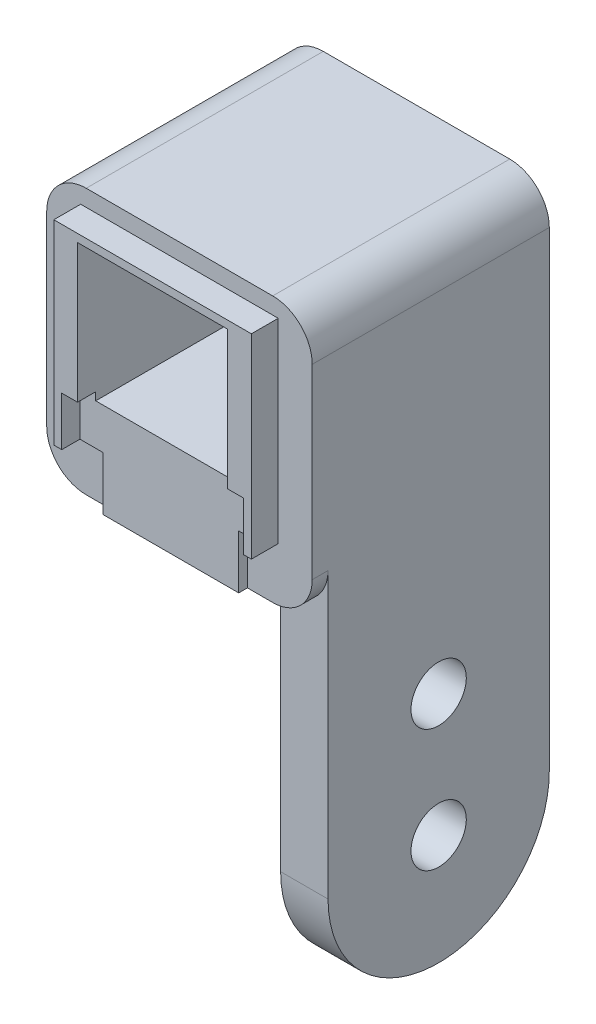
ISO-10303-21;
HEADER;
FILE_DESCRIPTION(('STEP AP214'),'2;1');
FILE_NAME('part.step','',(''),(''),'','','');
FILE_SCHEMA(('AUTOMOTIVE_DESIGN { 1 0 10303 214 1 1 1 1 }'));
ENDSEC;
DATA;
#1=APPLICATION_CONTEXT('core data for automotive mechanical design processes');
#2=APPLICATION_PROTOCOL_DEFINITION('international standard','automotive_design',2000,#1);
#3=PRODUCT_CONTEXT('',#1,'mechanical');
#4=PRODUCT('Part','Part','',(#3));
#5=PRODUCT_RELATED_PRODUCT_CATEGORY('part','',(#4));
#6=PRODUCT_DEFINITION_FORMATION('','',#4);
#7=PRODUCT_DEFINITION_CONTEXT('part definition',#1,'design');
#8=PRODUCT_DEFINITION('design','',#6,#7);
#9=PRODUCT_DEFINITION_SHAPE('','',#8);
#10=(LENGTH_UNIT() NAMED_UNIT(*) SI_UNIT(.MILLI.,.METRE.));
#11=(NAMED_UNIT(*) PLANE_ANGLE_UNIT() SI_UNIT($,.RADIAN.));
#12=(NAMED_UNIT(*) SI_UNIT($,.STERADIAN.) SOLID_ANGLE_UNIT());
#13=UNCERTAINTY_MEASURE_WITH_UNIT(LENGTH_MEASURE(1.E-05),#10,'distance_accuracy_value','');
#14=(GEOMETRIC_REPRESENTATION_CONTEXT(3) GLOBAL_UNCERTAINTY_ASSIGNED_CONTEXT((#13)) GLOBAL_UNIT_ASSIGNED_CONTEXT((#10,
#11,#12)) REPRESENTATION_CONTEXT('',''));
#15=CARTESIAN_POINT('',(0.,0.,0.));
#16=DIRECTION('',(0.,0.,1.));
#17=DIRECTION('',(1.,0.,0.));
#18=AXIS2_PLACEMENT_3D('',#15,#16,#17);
#19=CARTESIAN_POINT('',(0.,0.,1.1));
#20=DIRECTION('',(0.,0.,1.));
#21=DIRECTION('',(1.,0.,0.));
#22=AXIS2_PLACEMENT_3D('',#19,#20,#21);
#23=PLANE('',#22);
#24=DIRECTION('',(1.,0.,0.));
#25=VECTOR('',#24,1.);
#26=CARTESIAN_POINT('',(0.,-9.12041884816754,1.1));
#27=LINE('',#26,#25);
#28=CARTESIAN_POINT('',(9.09206947866898,-9.12041884816754,1.1));
#29=VERTEX_POINT('',#28);
#30=CARTESIAN_POINT('',(11.992069478669,-9.12041884816754,1.1));
#31=VERTEX_POINT('',#30);
#32=EDGE_CURVE('E52',#29,#31,#27,.T.);
#33=ORIENTED_EDGE('',*,*,#32,.T.);
#34=DIRECTION('',(0.,1.,0.));
#35=VECTOR('',#34,1.);
#36=CARTESIAN_POINT('',(11.992069478669,-9.12041884816754,1.1));
#37=LINE('',#36,#35);
#38=CARTESIAN_POINT('',(11.992069478669,-2.92041884816754,1.1));
#39=VERTEX_POINT('',#38);
#40=EDGE_CURVE('E259',#31,#39,#37,.T.);
#41=ORIENTED_EDGE('',*,*,#40,.T.);
#42=DIRECTION('',(-1.,0.,0.));
#43=VECTOR('',#42,1.);
#44=CARTESIAN_POINT('',(-12.007930521331,-2.92041884816754,1.1));
#45=LINE('',#44,#43);
#46=CARTESIAN_POINT('',(9.99206947866899,-2.92041884816754,1.1));
#47=VERTEX_POINT('',#46);
#48=EDGE_CURVE('E280',#39,#47,#45,.T.);
#49=ORIENTED_EDGE('',*,*,#48,.T.);
#50=DIRECTION('',(0.,1.,0.));
#51=VECTOR('',#50,1.);
#52=CARTESIAN_POINT('',(9.99206947866899,0.,1.1));
#53=LINE('',#52,#51);
#54=CARTESIAN_POINT('',(9.99206947866899,-3.92041884816754,1.1));
#55=VERTEX_POINT('',#54);
#56=EDGE_CURVE('E287',#55,#47,#53,.T.);
#57=ORIENTED_EDGE('',*,*,#56,.F.);
#58=DIRECTION('',(-1.,0.,0.));
#59=VECTOR('',#58,1.);
#60=CARTESIAN_POINT('',(0.,-3.92041884816754,1.1));
#61=LINE('',#60,#59);
#62=CARTESIAN_POINT('',(-9.00793052133102,-3.92041884816754,1.1));
#63=VERTEX_POINT('',#62);
#64=EDGE_CURVE('E314',#55,#63,#61,.T.);
#65=ORIENTED_EDGE('',*,*,#64,.T.);
#66=DIRECTION('',(0.,1.,0.));
#67=VECTOR('',#66,1.);
#68=CARTESIAN_POINT('',(-9.00793052133102,0.,1.1));
#69=LINE('',#68,#67);
#70=CARTESIAN_POINT('',(-9.00793052133102,-2.92041884816754,1.1));
#71=VERTEX_POINT('',#70);
#72=EDGE_CURVE('E282',#63,#71,#69,.T.);
#73=ORIENTED_EDGE('',*,*,#72,.T.);
#74=CARTESIAN_POINT('',(-11.007930521331,-2.92041884816754,1.1));
#75=VERTEX_POINT('',#74);
#76=EDGE_CURVE('E283',#71,#75,#45,.T.);
#77=ORIENTED_EDGE('',*,*,#76,.T.);
#78=DIRECTION('',(0.,1.,0.));
#79=VECTOR('',#78,1.);
#80=CARTESIAN_POINT('',(-11.007930521331,-9.12041884816754,1.1));
#81=LINE('',#80,#79);
#82=CARTESIAN_POINT('',(-11.007930521331,-9.12041884816754,1.1));
#83=VERTEX_POINT('',#82);
#84=EDGE_CURVE('E276',#83,#75,#81,.T.);
#85=ORIENTED_EDGE('',*,*,#84,.F.);
#86=CARTESIAN_POINT('',(-8.10793052133102,-9.12041884816754,1.1));
#87=VERTEX_POINT('',#86);
#88=EDGE_CURVE('E316',#83,#87,#27,.T.);
#89=ORIENTED_EDGE('',*,*,#88,.T.);
#90=DIRECTION('',(0.,-1.,0.));
#91=VECTOR('',#90,1.);
#92=CARTESIAN_POINT('',(-8.10793052133102,0.,1.1));
#93=LINE('',#92,#91);
#94=CARTESIAN_POINT('',(-8.10793052133102,-15.9204188481675,1.1));
#95=VERTEX_POINT('',#94);
#96=EDGE_CURVE('E297',#87,#95,#93,.T.);
#97=ORIENTED_EDGE('',*,*,#96,.T.);
#98=DIRECTION('',(1.,0.,0.));
#99=VECTOR('',#98,1.);
#100=CARTESIAN_POINT('',(0.,-15.9204188481675,1.1));
#101=LINE('',#100,#99);
#102=CARTESIAN_POINT('',(9.09206947866898,-15.9204188481675,1.1));
#103=VERTEX_POINT('',#102);
#104=EDGE_CURVE('E300',#95,#103,#101,.T.);
#105=ORIENTED_EDGE('',*,*,#104,.T.);
#106=DIRECTION('',(0.,-1.,0.));
#107=VECTOR('',#106,1.);
#108=CARTESIAN_POINT('',(9.09206947866898,0.,1.1));
#109=LINE('',#108,#107);
#110=EDGE_CURVE('E294',#29,#103,#109,.T.);
#111=ORIENTED_EDGE('',*,*,#110,.F.);
#112=EDGE_LOOP('',(#33,#41,#49,#57,#65,#73,#77,#85,#89,#97,#105,#111));
#113=FACE_BOUND('',#112,.T.);
#114=ADVANCED_FACE('F37',(#113),#23,.T.);
#115=CARTESIAN_POINT('',(-12.007930521331,-2.92041884816754,1.1));
#116=DIRECTION('',(0.,1.,0.));
#117=DIRECTION('',(-1.,0.,0.));
#118=AXIS2_PLACEMENT_3D('',#115,#116,#117);
#119=PLANE('',#118);
#120=DIRECTION('',(0.,0.,-1.));
#121=VECTOR('',#120,1.);
#122=CARTESIAN_POINT('',(11.992069478669,-2.92041884816754,3.4));
#123=LINE('',#122,#121);
#124=CARTESIAN_POINT('',(11.992069478669,-2.92041884816754,3.4));
#125=VERTEX_POINT('',#124);
#126=EDGE_CURVE('E60',#125,#39,#123,.T.);
#127=ORIENTED_EDGE('',*,*,#126,.F.);
#128=DIRECTION('',(-1.,0.,0.));
#129=VECTOR('',#128,1.);
#130=CARTESIAN_POINT('',(-12.007930521331,-2.92041884816754,3.4));
#131=LINE('',#130,#129);
#132=CARTESIAN_POINT('',(9.99206947866899,-2.92041884816754,3.4));
#133=VERTEX_POINT('',#132);
#134=EDGE_CURVE('E284',#125,#133,#131,.T.);
#135=ORIENTED_EDGE('',*,*,#134,.T.);
#136=DIRECTION('',(0.,0.,1.));
#137=VECTOR('',#136,1.);
#138=CARTESIAN_POINT('',(9.99206947866899,-2.92041884816754,3.4));
#139=LINE('',#138,#137);
#140=EDGE_CURVE('E290',#47,#133,#139,.T.);
#141=ORIENTED_EDGE('',*,*,#140,.F.);
#142=ORIENTED_EDGE('',*,*,#48,.F.);
#143=EDGE_LOOP('',(#127,#135,#141,#142));
#144=FACE_BOUND('',#143,.T.);
#145=ADVANCED_FACE('F548',(#144),#119,.F.);
#146=DIRECTION('',(0.,0.,1.));
#147=VECTOR('',#146,1.);
#148=CARTESIAN_POINT('',(-11.007930521331,-2.92041884816754,3.4));
#149=LINE('',#148,#147);
#150=CARTESIAN_POINT('',(-11.007930521331,-2.92041884816754,3.4));
#151=VERTEX_POINT('',#150);
#152=EDGE_CURVE('E265',#75,#151,#149,.T.);
#153=ORIENTED_EDGE('',*,*,#152,.F.);
#154=ORIENTED_EDGE('',*,*,#76,.F.);
#155=DIRECTION('',(0.,0.,1.));
#156=VECTOR('',#155,1.);
#157=CARTESIAN_POINT('',(-9.00793052133102,-2.92041884816754,3.4));
#158=LINE('',#157,#156);
#159=CARTESIAN_POINT('',(-9.00793052133102,-2.92041884816754,3.4));
#160=VERTEX_POINT('',#159);
#161=EDGE_CURVE('E11',#71,#160,#158,.T.);
#162=ORIENTED_EDGE('',*,*,#161,.T.);
#163=EDGE_CURVE('E279',#160,#151,#131,.T.);
#164=ORIENTED_EDGE('',*,*,#163,.T.);
#165=EDGE_LOOP('',(#153,#154,#162,#164));
#166=FACE_BOUND('',#165,.T.);
#167=ADVANCED_FACE('F563',(#166),#119,.F.);
#168=CARTESIAN_POINT('',(0.,-9.12041884816754,3.4));
#169=DIRECTION('',(0.,1.,0.));
#170=DIRECTION('',(0.,0.,1.));
#171=AXIS2_PLACEMENT_3D('',#168,#169,#170);
#172=PLANE('',#171);
#173=ORIENTED_EDGE('',*,*,#88,.F.);
#174=DIRECTION('',(0.,0.,1.));
#175=VECTOR('',#174,1.);
#176=CARTESIAN_POINT('',(-11.007930521331,-9.12041884816754,3.4));
#177=LINE('',#176,#175);
#178=CARTESIAN_POINT('',(-11.007930521331,-9.12041884816754,3.4));
#179=VERTEX_POINT('',#178);
#180=EDGE_CURVE('E266',#83,#179,#177,.T.);
#181=ORIENTED_EDGE('',*,*,#180,.T.);
#182=DIRECTION('',(-1.,0.,0.));
#183=VECTOR('',#182,1.);
#184=CARTESIAN_POINT('',(-12.007930521331,-9.12041884816754,3.4));
#185=LINE('',#184,#183);
#186=CARTESIAN_POINT('',(-12.007930521331,-9.12041884816754,3.4));
#187=VERTEX_POINT('',#186);
#188=EDGE_CURVE('E268',#179,#187,#185,.T.);
#189=ORIENTED_EDGE('',*,*,#188,.T.);
#190=DIRECTION('',(0.,0.,-1.));
#191=VECTOR('',#190,1.);
#192=CARTESIAN_POINT('',(-12.007930521331,-9.12041884816754,3.4));
#193=LINE('',#192,#191);
#194=CARTESIAN_POINT('',(-12.007930521331,-9.12041884816754,0.));
#195=VERTEX_POINT('',#194);
#196=EDGE_CURVE('E239',#187,#195,#193,.T.);
#197=ORIENTED_EDGE('',*,*,#196,.T.);
#198=DIRECTION('',(1.,0.,0.));
#199=VECTOR('',#198,1.);
#200=CARTESIAN_POINT('',(0.,-9.12041884816754,0.));
#201=LINE('',#200,#199);
#202=CARTESIAN_POINT('',(-8.10793052133102,-9.12041884816754,0.));
#203=VERTEX_POINT('',#202);
#204=EDGE_CURVE('E251',#195,#203,#201,.T.);
#205=ORIENTED_EDGE('',*,*,#204,.T.);
#206=DIRECTION('',(0.,0.,-1.));
#207=VECTOR('',#206,1.);
#208=CARTESIAN_POINT('',(-8.10793052133102,-9.12041884816754,1.1));
#209=LINE('',#208,#207);
#210=EDGE_CURVE('E310',#87,#203,#209,.T.);
#211=ORIENTED_EDGE('',*,*,#210,.F.);
#212=EDGE_LOOP('',(#173,#181,#189,#197,#205,#211));
#213=FACE_BOUND('',#212,.T.);
#214=ADVANCED_FACE('F514',(#213),#172,.F.);
#215=CARTESIAN_POINT('',(0.,-3.92041884816754,3.4));
#216=DIRECTION('',(0.,1.,0.));
#217=DIRECTION('',(0.,0.,1.));
#218=AXIS2_PLACEMENT_3D('',#215,#216,#217);
#219=PLANE('',#218);
#220=ORIENTED_EDGE('',*,*,#64,.F.);
#221=DIRECTION('',(0.,0.,-1.));
#222=VECTOR('',#221,1.);
#223=CARTESIAN_POINT('',(9.99206947866899,-3.92041884816754,3.4));
#224=LINE('',#223,#222);
#225=CARTESIAN_POINT('',(9.99206947866899,-3.92041884816754,-27.));
#226=VERTEX_POINT('',#225);
#227=EDGE_CURVE('E414',#55,#226,#224,.T.);
#228=ORIENTED_EDGE('',*,*,#227,.T.);
#229=DIRECTION('',(1.,0.,0.));
#230=VECTOR('',#229,1.);
#231=CARTESIAN_POINT('',(0.,-3.92041884816754,-27.));
#232=LINE('',#231,#230);
#233=CARTESIAN_POINT('',(-9.00793052133102,-3.92041884816754,-27.));
#234=VERTEX_POINT('',#233);
#235=EDGE_CURVE('E372',#234,#226,#232,.T.);
#236=ORIENTED_EDGE('',*,*,#235,.F.);
#237=DIRECTION('',(0.,0.,-1.));
#238=VECTOR('',#237,1.);
#239=CARTESIAN_POINT('',(-9.00793052133102,-3.92041884816754,3.4));
#240=LINE('',#239,#238);
#241=EDGE_CURVE('E412',#63,#234,#240,.T.);
#242=ORIENTED_EDGE('',*,*,#241,.F.);
#243=EDGE_LOOP('',(#220,#228,#236,#242));
#244=FACE_BOUND('',#243,.T.);
#245=ADVANCED_FACE('F608',(#244),#219,.T.);
#246=DIRECTION('',(0.,0.,-1.));
#247=VECTOR('',#246,1.);
#248=CARTESIAN_POINT('',(12.992069478669,-9.12041884816754,3.4));
#249=LINE('',#248,#247);
#250=CARTESIAN_POINT('',(12.992069478669,-9.12041884816754,3.4));
#251=VERTEX_POINT('',#250);
#252=CARTESIAN_POINT('',(12.992069478669,-9.12041884816754,0.));
#253=VERTEX_POINT('',#252);
#254=EDGE_CURVE('E227',#251,#253,#249,.T.);
#255=ORIENTED_EDGE('',*,*,#254,.F.);
#256=DIRECTION('',(-1.,0.,0.));
#257=VECTOR('',#256,1.);
#258=CARTESIAN_POINT('',(12.992069478669,-9.12041884816754,3.4));
#259=LINE('',#258,#257);
#260=CARTESIAN_POINT('',(11.992069478669,-9.12041884816754,3.4));
#261=VERTEX_POINT('',#260);
#262=EDGE_CURVE('E231',#251,#261,#259,.T.);
#263=ORIENTED_EDGE('',*,*,#262,.T.);
#264=DIRECTION('',(0.,0.,-1.));
#265=VECTOR('',#264,1.);
#266=CARTESIAN_POINT('',(11.992069478669,-9.12041884816754,3.4));
#267=LINE('',#266,#265);
#268=EDGE_CURVE('E257',#261,#31,#267,.T.);
#269=ORIENTED_EDGE('',*,*,#268,.T.);
#270=ORIENTED_EDGE('',*,*,#32,.F.);
#271=DIRECTION('',(0.,0.,-1.));
#272=VECTOR('',#271,1.);
#273=CARTESIAN_POINT('',(9.09206947866898,-9.12041884816754,1.1));
#274=LINE('',#273,#272);
#275=CARTESIAN_POINT('',(9.09206947866898,-9.12041884816754,0.));
#276=VERTEX_POINT('',#275);
#277=EDGE_CURVE('E312',#29,#276,#274,.T.);
#278=ORIENTED_EDGE('',*,*,#277,.T.);
#279=EDGE_CURVE('E235',#276,#253,#201,.T.);
#280=ORIENTED_EDGE('',*,*,#279,.T.);
#281=EDGE_LOOP('',(#255,#263,#269,#270,#278,#280));
#282=FACE_BOUND('',#281,.T.);
#283=ADVANCED_FACE('F229',(#282),#172,.F.);
#284=CARTESIAN_POINT('',(0.,0.,3.4));
#285=DIRECTION('',(0.,0.,1.));
#286=DIRECTION('',(1.,0.,0.));
#287=AXIS2_PLACEMENT_3D('',#284,#285,#286);
#288=PLANE('',#287);
#289=ORIENTED_EDGE('',*,*,#134,.F.);
#290=DIRECTION('',(0.,1.,0.));
#291=VECTOR('',#290,1.);
#292=CARTESIAN_POINT('',(11.992069478669,-9.12041884816754,3.4));
#293=LINE('',#292,#291);
#294=EDGE_CURVE('E255',#261,#125,#293,.T.);
#295=ORIENTED_EDGE('',*,*,#294,.F.);
#296=ORIENTED_EDGE('',*,*,#262,.F.);
#297=DIRECTION('',(0.,-1.,0.));
#298=VECTOR('',#297,1.);
#299=CARTESIAN_POINT('',(12.992069478669,0.,3.4));
#300=LINE('',#299,#298);
#301=CARTESIAN_POINT('',(12.992069478669,15.5795811518325,3.4));
#302=VERTEX_POINT('',#301);
#303=EDGE_CURVE('E243',#302,#251,#300,.T.);
#304=ORIENTED_EDGE('',*,*,#303,.F.);
#305=DIRECTION('',(1.,0.,0.));
#306=VECTOR('',#305,1.);
#307=CARTESIAN_POINT('',(0.,15.5795811518325,3.4));
#308=LINE('',#307,#306);
#309=CARTESIAN_POINT('',(-12.007930521331,15.5795811518325,3.4));
#310=VERTEX_POINT('',#309);
#311=EDGE_CURVE('E250',#310,#302,#308,.T.);
#312=ORIENTED_EDGE('',*,*,#311,.F.);
#313=DIRECTION('',(0.,-1.,0.));
#314=VECTOR('',#313,1.);
#315=CARTESIAN_POINT('',(-12.007930521331,0.,3.4));
#316=LINE('',#315,#314);
#317=EDGE_CURVE('E391',#310,#187,#316,.T.);
#318=ORIENTED_EDGE('',*,*,#317,.T.);
#319=ORIENTED_EDGE('',*,*,#188,.F.);
#320=DIRECTION('',(0.,1.,0.));
#321=VECTOR('',#320,1.);
#322=CARTESIAN_POINT('',(-11.007930521331,-9.12041884816754,3.4));
#323=LINE('',#322,#321);
#324=EDGE_CURVE('E271',#179,#151,#323,.T.);
#325=ORIENTED_EDGE('',*,*,#324,.T.);
#326=ORIENTED_EDGE('',*,*,#163,.F.);
#327=DIRECTION('',(0.,-1.,0.));
#328=VECTOR('',#327,1.);
#329=CARTESIAN_POINT('',(-9.00793052133102,0.,3.4));
#330=LINE('',#329,#328);
#331=CARTESIAN_POINT('',(-9.00793052133102,14.5795811518325,3.4));
#332=VERTEX_POINT('',#331);
#333=EDGE_CURVE('E240',#332,#160,#330,.T.);
#334=ORIENTED_EDGE('',*,*,#333,.F.);
#335=DIRECTION('',(1.,0.,0.));
#336=VECTOR('',#335,1.);
#337=CARTESIAN_POINT('',(0.,14.5795811518325,3.4));
#338=LINE('',#337,#336);
#339=CARTESIAN_POINT('',(9.99206947866899,14.5795811518325,3.4));
#340=VERTEX_POINT('',#339);
#341=EDGE_CURVE('E394',#332,#340,#338,.T.);
#342=ORIENTED_EDGE('',*,*,#341,.T.);
#343=DIRECTION('',(0.,-1.,0.));
#344=VECTOR('',#343,1.);
#345=CARTESIAN_POINT('',(9.99206947866899,0.,3.4));
#346=LINE('',#345,#344);
#347=EDGE_CURVE('E397',#340,#133,#346,.T.);
#348=ORIENTED_EDGE('',*,*,#347,.T.);
#349=EDGE_LOOP('',(#289,#295,#296,#304,#312,#318,#319,#325,#326,#334,#342,#348));
#350=FACE_BOUND('',#349,.T.);
#351=ADVANCED_FACE('F253',(#350),#288,.T.);
#352=CARTESIAN_POINT('',(0.,14.5795811518325,3.4));
#353=DIRECTION('',(0.,1.,0.));
#354=DIRECTION('',(0.,0.,1.));
#355=AXIS2_PLACEMENT_3D('',#352,#353,#354);
#356=PLANE('',#355);
#357=DIRECTION('',(0.,0.,-1.));
#358=VECTOR('',#357,1.);
#359=CARTESIAN_POINT('',(-9.00793052133102,14.5795811518325,3.4));
#360=LINE('',#359,#358);
#361=CARTESIAN_POINT('',(-9.00793052133102,14.5795811518325,-27.));
#362=VERTEX_POINT('',#361);
#363=EDGE_CURVE('E410',#332,#362,#360,.T.);
#364=ORIENTED_EDGE('',*,*,#363,.T.);
#365=DIRECTION('',(1.,0.,0.));
#366=VECTOR('',#365,1.);
#367=CARTESIAN_POINT('',(0.,14.5795811518325,-27.));
#368=LINE('',#367,#366);
#369=CARTESIAN_POINT('',(9.99206947866899,14.5795811518325,-27.));
#370=VERTEX_POINT('',#369);
#371=EDGE_CURVE('E365',#362,#370,#368,.T.);
#372=ORIENTED_EDGE('',*,*,#371,.T.);
#373=DIRECTION('',(0.,0.,-1.));
#374=VECTOR('',#373,1.);
#375=CARTESIAN_POINT('',(9.99206947866899,14.5795811518325,3.4));
#376=LINE('',#375,#374);
#377=EDGE_CURVE('E416',#340,#370,#376,.T.);
#378=ORIENTED_EDGE('',*,*,#377,.F.);
#379=ORIENTED_EDGE('',*,*,#341,.F.);
#380=EDGE_LOOP('',(#364,#372,#378,#379));
#381=FACE_BOUND('',#380,.T.);
#382=ADVANCED_FACE('F542',(#381),#356,.F.);
#383=CARTESIAN_POINT('',(9.99206947866899,0.,3.4));
#384=DIRECTION('',(1.,0.,0.));
#385=DIRECTION('',(0.,1.,0.));
#386=AXIS2_PLACEMENT_3D('',#383,#384,#385);
#387=PLANE('',#386);
#388=ORIENTED_EDGE('',*,*,#56,.T.);
#389=ORIENTED_EDGE('',*,*,#140,.T.);
#390=ORIENTED_EDGE('',*,*,#347,.F.);
#391=ORIENTED_EDGE('',*,*,#377,.T.);
#392=DIRECTION('',(0.,-1.,0.));
#393=VECTOR('',#392,1.);
#394=CARTESIAN_POINT('',(9.99206947866899,0.,-27.));
#395=LINE('',#394,#393);
#396=EDGE_CURVE('E368',#370,#226,#395,.T.);
#397=ORIENTED_EDGE('',*,*,#396,.T.);
#398=ORIENTED_EDGE('',*,*,#227,.F.);
#399=EDGE_LOOP('',(#388,#389,#390,#391,#397,#398));
#400=FACE_BOUND('',#399,.T.);
#401=ADVANCED_FACE('F544',(#400),#387,.F.);
#402=CARTESIAN_POINT('',(12.992069478669,0.,3.4));
#403=DIRECTION('',(1.,0.,0.));
#404=DIRECTION('',(0.,1.,0.));
#405=AXIS2_PLACEMENT_3D('',#402,#403,#404);
#406=PLANE('',#405);
#407=ORIENTED_EDGE('',*,*,#303,.T.);
#408=ORIENTED_EDGE('',*,*,#254,.T.);
#409=DIRECTION('',(0.,-1.,0.));
#410=VECTOR('',#409,1.);
#411=CARTESIAN_POINT('',(12.992069478669,0.,0.));
#412=LINE('',#411,#410);
#413=CARTESIAN_POINT('',(12.992069478669,15.5795811518325,0.));
#414=VERTEX_POINT('',#413);
#415=EDGE_CURVE('E378',#414,#253,#412,.T.);
#416=ORIENTED_EDGE('',*,*,#415,.F.);
#417=DIRECTION('',(0.,0.,-1.));
#418=VECTOR('',#417,1.);
#419=CARTESIAN_POINT('',(12.992069478669,15.5795811518325,3.4));
#420=LINE('',#419,#418);
#421=EDGE_CURVE('E246',#302,#414,#420,.T.);
#422=ORIENTED_EDGE('',*,*,#421,.F.);
#423=EDGE_LOOP('',(#407,#408,#416,#422));
#424=FACE_BOUND('',#423,.T.);
#425=ADVANCED_FACE('F244',(#424),#406,.T.);
#426=CARTESIAN_POINT('',(0.,15.5795811518325,3.4));
#427=DIRECTION('',(0.,1.,0.));
#428=DIRECTION('',(0.,0.,1.));
#429=AXIS2_PLACEMENT_3D('',#426,#427,#428);
#430=PLANE('',#429);
#431=DIRECTION('',(1.,0.,0.));
#432=VECTOR('',#431,1.);
#433=CARTESIAN_POINT('',(0.,15.5795811518325,0.));
#434=LINE('',#433,#432);
#435=CARTESIAN_POINT('',(-12.007930521331,15.5795811518325,0.));
#436=VERTEX_POINT('',#435);
#437=EDGE_CURVE('E403',#436,#414,#434,.T.);
#438=ORIENTED_EDGE('',*,*,#437,.F.);
#439=DIRECTION('',(0.,0.,-1.));
#440=VECTOR('',#439,1.);
#441=CARTESIAN_POINT('',(-12.007930521331,15.5795811518325,3.4));
#442=LINE('',#441,#440);
#443=EDGE_CURVE('E420',#310,#436,#442,.T.);
#444=ORIENTED_EDGE('',*,*,#443,.F.);
#445=ORIENTED_EDGE('',*,*,#311,.T.);
#446=ORIENTED_EDGE('',*,*,#421,.T.);
#447=EDGE_LOOP('',(#438,#444,#445,#446));
#448=FACE_BOUND('',#447,.T.);
#449=ADVANCED_FACE('F521',(#448),#430,.T.);
#450=CARTESIAN_POINT('',(-12.007930521331,0.,3.4));
#451=DIRECTION('',(1.,0.,0.));
#452=DIRECTION('',(0.,1.,0.));
#453=AXIS2_PLACEMENT_3D('',#450,#451,#452);
#454=PLANE('',#453);
#455=ORIENTED_EDGE('',*,*,#196,.F.);
#456=ORIENTED_EDGE('',*,*,#317,.F.);
#457=ORIENTED_EDGE('',*,*,#443,.T.);
#458=DIRECTION('',(0.,-1.,0.));
#459=VECTOR('',#458,1.);
#460=CARTESIAN_POINT('',(-12.007930521331,0.,0.));
#461=LINE('',#460,#459);
#462=EDGE_CURVE('E405',#436,#195,#461,.T.);
#463=ORIENTED_EDGE('',*,*,#462,.T.);
#464=EDGE_LOOP('',(#455,#456,#457,#463));
#465=FACE_BOUND('',#464,.T.);
#466=ADVANCED_FACE('F518',(#465),#454,.F.);
#467=CARTESIAN_POINT('',(-9.00793052133102,0.,3.4));
#468=DIRECTION('',(1.,0.,0.));
#469=DIRECTION('',(0.,1.,0.));
#470=AXIS2_PLACEMENT_3D('',#467,#468,#469);
#471=PLANE('',#470);
#472=ORIENTED_EDGE('',*,*,#161,.F.);
#473=ORIENTED_EDGE('',*,*,#72,.F.);
#474=ORIENTED_EDGE('',*,*,#241,.T.);
#475=DIRECTION('',(0.,-1.,0.));
#476=VECTOR('',#475,1.);
#477=CARTESIAN_POINT('',(-9.00793052133102,0.,-27.));
#478=LINE('',#477,#476);
#479=EDGE_CURVE('E375',#362,#234,#478,.T.);
#480=ORIENTED_EDGE('',*,*,#479,.F.);
#481=ORIENTED_EDGE('',*,*,#363,.F.);
#482=ORIENTED_EDGE('',*,*,#333,.T.);
#483=EDGE_LOOP('',(#472,#473,#474,#480,#481,#482));
#484=FACE_BOUND('',#483,.T.);
#485=ADVANCED_FACE('F535',(#484),#471,.T.);
#486=CARTESIAN_POINT('',(17.292069478669,0.,-27.));
#487=DIRECTION('',(-1.,0.,0.));
#488=DIRECTION('',(0.,-1.,0.));
#489=AXIS2_PLACEMENT_3D('',#486,#487,#488);
#490=PLANE('',#489);
#491=DIRECTION('',(0.,-1.,0.));
#492=VECTOR('',#491,1.);
#493=CARTESIAN_POINT('',(17.292069478669,0.,0.));
#494=LINE('',#493,#492);
#495=CARTESIAN_POINT('',(17.292069478669,12.6795811518325,0.));
#496=VERTEX_POINT('',#495);
#497=CARTESIAN_POINT('',(17.292069478669,-10.9204188481675,0.));
#498=VERTEX_POINT('',#497);
#499=EDGE_CURVE('E364',#496,#498,#494,.T.);
#500=ORIENTED_EDGE('',*,*,#499,.T.);
#501=DIRECTION('',(0.,0.,1.));
#502=VECTOR('',#501,1.);
#503=CARTESIAN_POINT('',(17.292069478669,-10.9204188481675,-2.));
#504=LINE('',#503,#502);
#505=CARTESIAN_POINT('',(17.292069478669,-10.9204188481675,-2.));
#506=VERTEX_POINT('',#505);
#507=EDGE_CURVE('E439',#498,#506,#504,.F.);
#508=ORIENTED_EDGE('',*,*,#507,.T.);
#509=DIRECTION('',(0.,1.,0.));
#510=VECTOR('',#509,1.);
#511=CARTESIAN_POINT('',(17.292069478669,0.,-2.));
#512=LINE('',#511,#510);
#513=CARTESIAN_POINT('',(17.292069478669,-46.9204188481675,-2.));
#514=VERTEX_POINT('',#513);
#515=EDGE_CURVE('E339',#514,#506,#512,.T.);
#516=ORIENTED_EDGE('',*,*,#515,.F.);
#517=CARTESIAN_POINT('',(17.292069478669,-46.9204188481675,-16.));
#518=DIRECTION('',(1.,0.,0.));
#519=DIRECTION('',(0.,1.,0.));
#520=AXIS2_PLACEMENT_3D('',#517,#518,#519);
#521=CIRCLE('',#520,14.);
#522=CARTESIAN_POINT('',(17.292069478669,-46.9204188481675,-30.));
#523=VERTEX_POINT('',#522);
#524=EDGE_CURVE('E318',#514,#523,#521,.T.);
#525=ORIENTED_EDGE('',*,*,#524,.T.);
#526=DIRECTION('',(0.,-1.,0.));
#527=VECTOR('',#526,1.);
#528=CARTESIAN_POINT('',(17.292069478669,17.6795811518325,-30.));
#529=LINE('',#528,#527);
#530=CARTESIAN_POINT('',(17.292069478669,12.6795811518325,-30.));
#531=VERTEX_POINT('',#530);
#532=EDGE_CURVE('E348',#531,#523,#529,.T.);
#533=ORIENTED_EDGE('',*,*,#532,.F.);
#534=DIRECTION('',(0.,0.,1.));
#535=VECTOR('',#534,1.);
#536=CARTESIAN_POINT('',(17.292069478669,12.6795811518325,-27.));
#537=LINE('',#536,#535);
#538=EDGE_CURVE('E436',#531,#496,#537,.T.);
#539=ORIENTED_EDGE('',*,*,#538,.T.);
#540=EDGE_LOOP('',(#500,#508,#516,#525,#533,#539));
#541=FACE_BOUND('',#540,.T.);
#542=CARTESIAN_POINT('',(17.292069478669,-31.4204188481675,-16.));
#543=DIRECTION('',(1.,0.,0.));
#544=DIRECTION('',(0.,1.,0.));
#545=AXIS2_PLACEMENT_3D('',#542,#543,#544);
#546=CIRCLE('',#545,3.5);
#547=CARTESIAN_POINT('',(17.292069478669,-27.9204188481675,-16.));
#548=VERTEX_POINT('',#547);
#549=EDGE_CURVE('E341',#548,#548,#546,.T.);
#550=ORIENTED_EDGE('',*,*,#549,.F.);
#551=EDGE_LOOP('',(#550));
#552=FACE_BOUND('',#551,.T.);
#553=CARTESIAN_POINT('',(17.292069478669,-46.9204188481675,-16.));
#554=DIRECTION('',(1.,0.,0.));
#555=DIRECTION('',(0.,1.,0.));
#556=AXIS2_PLACEMENT_3D('',#553,#554,#555);
#557=CIRCLE('',#556,3.5);
#558=CARTESIAN_POINT('',(17.292069478669,-43.4204188481675,-16.));
#559=VERTEX_POINT('',#558);
#560=EDGE_CURVE('E323',#559,#559,#557,.T.);
#561=ORIENTED_EDGE('',*,*,#560,.F.);
#562=EDGE_LOOP('',(#561));
#563=FACE_BOUND('',#562,.T.);
#564=ADVANCED_FACE('F477',(#541,#552,#563),#490,.F.);
#565=CARTESIAN_POINT('',(0.,-15.9204188481675,-27.));
#566=DIRECTION('',(0.,-1.,0.));
#567=DIRECTION('',(0.,0.,-1.));
#568=AXIS2_PLACEMENT_3D('',#565,#566,#567);
#569=PLANE('',#568);
#570=DIRECTION('',(1.,0.,0.));
#571=VECTOR('',#570,1.);
#572=CARTESIAN_POINT('',(11.292069478669,-15.9204188481675,-2.));
#573=LINE('',#572,#571);
#574=CARTESIAN_POINT('',(11.292069478669,-15.9204188481675,-2.));
#575=VERTEX_POINT('',#574);
#576=CARTESIAN_POINT('',(12.292069478669,-15.9204188481675,-2.));
#577=VERTEX_POINT('',#576);
#578=EDGE_CURVE('E349',#575,#577,#573,.T.);
#579=ORIENTED_EDGE('',*,*,#578,.T.);
#580=DIRECTION('',(0.,0.,1.));
#581=VECTOR('',#580,1.);
#582=CARTESIAN_POINT('',(12.292069478669,-15.9204188481675,0.));
#583=LINE('',#582,#581);
#584=CARTESIAN_POINT('',(12.292069478669,-15.9204188481675,0.));
#585=VERTEX_POINT('',#584);
#586=EDGE_CURVE('E425',#577,#585,#583,.T.);
#587=ORIENTED_EDGE('',*,*,#586,.T.);
#588=DIRECTION('',(1.,0.,0.));
#589=VECTOR('',#588,1.);
#590=CARTESIAN_POINT('',(0.,-15.9204188481675,0.));
#591=LINE('',#590,#589);
#592=CARTESIAN_POINT('',(9.09206947866898,-15.9204188481675,0.));
#593=VERTEX_POINT('',#592);
#594=EDGE_CURVE('E387',#593,#585,#591,.T.);
#595=ORIENTED_EDGE('',*,*,#594,.F.);
#596=DIRECTION('',(0.,0.,-1.));
#597=VECTOR('',#596,1.);
#598=CARTESIAN_POINT('',(9.09206947866898,-15.9204188481675,1.1));
#599=LINE('',#598,#597);
#600=EDGE_CURVE('E302',#103,#593,#599,.T.);
#601=ORIENTED_EDGE('',*,*,#600,.F.);
#602=ORIENTED_EDGE('',*,*,#104,.F.);
#603=DIRECTION('',(0.,0.,-1.));
#604=VECTOR('',#603,1.);
#605=CARTESIAN_POINT('',(-8.10793052133102,-15.9204188481675,1.1));
#606=LINE('',#605,#604);
#607=CARTESIAN_POINT('',(-8.10793052133102,-15.9204188481675,0.));
#608=VERTEX_POINT('',#607);
#609=EDGE_CURVE('E307',#95,#608,#606,.T.);
#610=ORIENTED_EDGE('',*,*,#609,.T.);
#611=CARTESIAN_POINT('',(-11.307930521331,-15.9204188481675,0.));
#612=VERTEX_POINT('',#611);
#613=EDGE_CURVE('E369',#612,#608,#591,.T.);
#614=ORIENTED_EDGE('',*,*,#613,.F.);
#615=DIRECTION('',(0.,0.,1.));
#616=VECTOR('',#615,1.);
#617=CARTESIAN_POINT('',(-11.307930521331,-15.9204188481675,-27.));
#618=LINE('',#617,#616);
#619=CARTESIAN_POINT('',(-11.307930521331,-15.9204188481675,-30.));
#620=VERTEX_POINT('',#619);
#621=EDGE_CURVE('E417',#612,#620,#618,.F.);
#622=ORIENTED_EDGE('',*,*,#621,.T.);
#623=DIRECTION('',(-1.,0.,0.));
#624=VECTOR('',#623,1.);
#625=CARTESIAN_POINT('',(17.292069478669,-15.9204188481675,-30.));
#626=LINE('',#625,#624);
#627=CARTESIAN_POINT('',(11.292069478669,-15.9204188481675,-30.));
#628=VERTEX_POINT('',#627);
#629=EDGE_CURVE('E355',#628,#620,#626,.T.);
#630=ORIENTED_EDGE('',*,*,#629,.F.);
#631=DIRECTION('',(0.,0.,-1.));
#632=VECTOR('',#631,1.);
#633=CARTESIAN_POINT('',(11.292069478669,-15.9204188481675,0.));
#634=LINE('',#633,#632);
#635=EDGE_CURVE('E326',#575,#628,#634,.T.);
#636=ORIENTED_EDGE('',*,*,#635,.F.);
#637=EDGE_LOOP('',(#579,#587,#595,#601,#602,#610,#614,#622,#630,#636));
#638=FACE_BOUND('',#637,.T.);
#639=ADVANCED_FACE('F468',(#638),#569,.T.);
#640=CARTESIAN_POINT('',(-16.307930521331,0.,-27.));
#641=DIRECTION('',(-1.,0.,0.));
#642=DIRECTION('',(0.,-1.,0.));
#643=AXIS2_PLACEMENT_3D('',#640,#641,#642);
#644=PLANE('',#643);
#645=DIRECTION('',(0.,1.,0.));
#646=VECTOR('',#645,1.);
#647=CARTESIAN_POINT('',(-16.307930521331,17.6795811518325,-30.));
#648=LINE('',#647,#646);
#649=CARTESIAN_POINT('',(-16.307930521331,-10.9204188481675,-30.));
#650=VERTEX_POINT('',#649);
#651=CARTESIAN_POINT('',(-16.307930521331,12.6795811518325,-30.));
#652=VERTEX_POINT('',#651);
#653=EDGE_CURVE('E358',#650,#652,#648,.T.);
#654=ORIENTED_EDGE('',*,*,#653,.F.);
#655=DIRECTION('',(0.,0.,1.));
#656=VECTOR('',#655,1.);
#657=CARTESIAN_POINT('',(-16.307930521331,-10.9204188481675,-27.));
#658=LINE('',#657,#656);
#659=CARTESIAN_POINT('',(-16.307930521331,-10.9204188481675,0.));
#660=VERTEX_POINT('',#659);
#661=EDGE_CURVE('E444',#650,#660,#658,.T.);
#662=ORIENTED_EDGE('',*,*,#661,.T.);
#663=DIRECTION('',(0.,-1.,0.));
#664=VECTOR('',#663,1.);
#665=CARTESIAN_POINT('',(-16.307930521331,0.,0.));
#666=LINE('',#665,#664);
#667=CARTESIAN_POINT('',(-16.307930521331,12.6795811518325,0.));
#668=VERTEX_POINT('',#667);
#669=EDGE_CURVE('E384',#668,#660,#666,.T.);
#670=ORIENTED_EDGE('',*,*,#669,.F.);
#671=DIRECTION('',(0.,0.,1.));
#672=VECTOR('',#671,1.);
#673=CARTESIAN_POINT('',(-16.307930521331,12.6795811518325,-30.));
#674=LINE('',#673,#672);
#675=EDGE_CURVE('E442',#668,#652,#674,.F.);
#676=ORIENTED_EDGE('',*,*,#675,.T.);
#677=EDGE_LOOP('',(#654,#662,#670,#676));
#678=FACE_BOUND('',#677,.T.);
#679=ADVANCED_FACE('F496',(#678),#644,.T.);
#680=CARTESIAN_POINT('',(0.,17.6795811518325,-27.));
#681=DIRECTION('',(0.,-1.,0.));
#682=DIRECTION('',(0.,0.,-1.));
#683=AXIS2_PLACEMENT_3D('',#680,#681,#682);
#684=PLANE('',#683);
#685=DIRECTION('',(1.,0.,0.));
#686=VECTOR('',#685,1.);
#687=CARTESIAN_POINT('',(0.,17.6795811518325,0.));
#688=LINE('',#687,#686);
#689=CARTESIAN_POINT('',(-11.307930521331,17.6795811518325,0.));
#690=VERTEX_POINT('',#689);
#691=CARTESIAN_POINT('',(12.292069478669,17.6795811518325,0.));
#692=VERTEX_POINT('',#691);
#693=EDGE_CURVE('E381',#690,#692,#688,.T.);
#694=ORIENTED_EDGE('',*,*,#693,.T.);
#695=DIRECTION('',(0.,0.,1.));
#696=VECTOR('',#695,1.);
#697=CARTESIAN_POINT('',(12.292069478669,17.6795811518325,-27.));
#698=LINE('',#697,#696);
#699=CARTESIAN_POINT('',(12.292069478669,17.6795811518325,-30.));
#700=VERTEX_POINT('',#699);
#701=EDGE_CURVE('E456',#692,#700,#698,.F.);
#702=ORIENTED_EDGE('',*,*,#701,.T.);
#703=DIRECTION('',(1.,0.,0.));
#704=VECTOR('',#703,1.);
#705=CARTESIAN_POINT('',(17.292069478669,17.6795811518325,-30.));
#706=LINE('',#705,#704);
#707=CARTESIAN_POINT('',(-11.307930521331,17.6795811518325,-30.));
#708=VERTEX_POINT('',#707);
#709=EDGE_CURVE('E361',#708,#700,#706,.T.);
#710=ORIENTED_EDGE('',*,*,#709,.F.);
#711=DIRECTION('',(0.,0.,1.));
#712=VECTOR('',#711,1.);
#713=CARTESIAN_POINT('',(-11.307930521331,17.6795811518325,0.));
#714=LINE('',#713,#712);
#715=EDGE_CURVE('E453',#708,#690,#714,.T.);
#716=ORIENTED_EDGE('',*,*,#715,.T.);
#717=EDGE_LOOP('',(#694,#702,#710,#716));
#718=FACE_BOUND('',#717,.T.);
#719=ADVANCED_FACE('F487',(#718),#684,.F.);
#720=CARTESIAN_POINT('',(0.,0.,0.));
#721=DIRECTION('',(0.,0.,1.));
#722=DIRECTION('',(1.,0.,0.));
#723=AXIS2_PLACEMENT_3D('',#720,#721,#722);
#724=PLANE('',#723);
#725=DIRECTION('',(0.,-1.,0.));
#726=VECTOR('',#725,1.);
#727=CARTESIAN_POINT('',(9.09206947866898,0.,0.));
#728=LINE('',#727,#726);
#729=EDGE_CURVE('E293',#276,#593,#728,.T.);
#730=ORIENTED_EDGE('',*,*,#729,.T.);
#731=ORIENTED_EDGE('',*,*,#594,.T.);
#732=CARTESIAN_POINT('',(12.292069478669,-10.9204188481675,0.));
#733=DIRECTION('',(0.,0.,1.));
#734=DIRECTION('',(1.,0.,0.));
#735=AXIS2_PLACEMENT_3D('',#732,#733,#734);
#736=CIRCLE('',#735,5.);
#737=EDGE_CURVE('E434',#585,#498,#736,.T.);
#738=ORIENTED_EDGE('',*,*,#737,.T.);
#739=ORIENTED_EDGE('',*,*,#499,.F.);
#740=CARTESIAN_POINT('',(12.292069478669,12.6795811518325,0.));
#741=DIRECTION('',(0.,0.,1.));
#742=DIRECTION('',(1.,0.,0.));
#743=AXIS2_PLACEMENT_3D('',#740,#741,#742);
#744=CIRCLE('',#743,5.);
#745=EDGE_CURVE('E430',#496,#692,#744,.T.);
#746=ORIENTED_EDGE('',*,*,#745,.T.);
#747=ORIENTED_EDGE('',*,*,#693,.F.);
#748=CARTESIAN_POINT('',(-11.307930521331,12.6795811518325,0.));
#749=DIRECTION('',(0.,0.,1.));
#750=DIRECTION('',(1.,0.,0.));
#751=AXIS2_PLACEMENT_3D('',#748,#749,#750);
#752=CIRCLE('',#751,5.);
#753=EDGE_CURVE('E428',#690,#668,#752,.T.);
#754=ORIENTED_EDGE('',*,*,#753,.T.);
#755=ORIENTED_EDGE('',*,*,#669,.T.);
#756=CARTESIAN_POINT('',(-11.307930521331,-10.9204188481675,0.));
#757=DIRECTION('',(0.,0.,1.));
#758=DIRECTION('',(1.,0.,0.));
#759=AXIS2_PLACEMENT_3D('',#756,#757,#758);
#760=CIRCLE('',#759,5.);
#761=EDGE_CURVE('E432',#660,#612,#760,.T.);
#762=ORIENTED_EDGE('',*,*,#761,.T.);
#763=ORIENTED_EDGE('',*,*,#613,.T.);
#764=DIRECTION('',(0.,-1.,0.));
#765=VECTOR('',#764,1.);
#766=CARTESIAN_POINT('',(-8.10793052133102,0.,0.));
#767=LINE('',#766,#765);
#768=EDGE_CURVE('E298',#203,#608,#767,.T.);
#769=ORIENTED_EDGE('',*,*,#768,.F.);
#770=ORIENTED_EDGE('',*,*,#204,.F.);
#771=ORIENTED_EDGE('',*,*,#462,.F.);
#772=ORIENTED_EDGE('',*,*,#437,.T.);
#773=ORIENTED_EDGE('',*,*,#415,.T.);
#774=ORIENTED_EDGE('',*,*,#279,.F.);
#775=EDGE_LOOP('',(#730,#731,#738,#739,#746,#747,#754,#755,#762,#763,#769,#770,#771,#772,#773,#774));
#776=FACE_BOUND('',#775,.T.);
#777=ADVANCED_FACE('F475',(#776),#724,.T.);
#778=CARTESIAN_POINT('',(0.,0.,-30.));
#779=DIRECTION('',(0.,0.,-1.));
#780=DIRECTION('',(-1.,0.,0.));
#781=AXIS2_PLACEMENT_3D('',#778,#779,#780);
#782=PLANE('',#781);
#783=ORIENTED_EDGE('',*,*,#629,.T.);
#784=CARTESIAN_POINT('',(-11.307930521331,-10.9204188481675,-30.));
#785=DIRECTION('',(0.,0.,-1.));
#786=DIRECTION('',(-1.,0.,0.));
#787=AXIS2_PLACEMENT_3D('',#784,#785,#786);
#788=CIRCLE('',#787,5.);
#789=EDGE_CURVE('E451',#620,#650,#788,.T.);
#790=ORIENTED_EDGE('',*,*,#789,.T.);
#791=ORIENTED_EDGE('',*,*,#653,.T.);
#792=CARTESIAN_POINT('',(-11.307930521331,12.6795811518325,-30.));
#793=DIRECTION('',(0.,0.,-1.));
#794=DIRECTION('',(-1.,0.,0.));
#795=AXIS2_PLACEMENT_3D('',#792,#793,#794);
#796=CIRCLE('',#795,5.);
#797=EDGE_CURVE('E447',#652,#708,#796,.T.);
#798=ORIENTED_EDGE('',*,*,#797,.T.);
#799=ORIENTED_EDGE('',*,*,#709,.T.);
#800=CARTESIAN_POINT('',(12.292069478669,12.6795811518325,-30.));
#801=DIRECTION('',(0.,0.,-1.));
#802=DIRECTION('',(-1.,0.,0.));
#803=AXIS2_PLACEMENT_3D('',#800,#801,#802);
#804=CIRCLE('',#803,5.);
#805=EDGE_CURVE('E449',#700,#531,#804,.T.);
#806=ORIENTED_EDGE('',*,*,#805,.T.);
#807=ORIENTED_EDGE('',*,*,#532,.T.);
#808=DIRECTION('',(1.,0.,0.));
#809=VECTOR('',#808,1.);
#810=CARTESIAN_POINT('',(11.292069478669,-46.9204188481675,-30.));
#811=LINE('',#810,#809);
#812=CARTESIAN_POINT('',(11.292069478669,-46.9204188481675,-30.));
#813=VERTEX_POINT('',#812);
#814=EDGE_CURVE('E336',#813,#523,#811,.T.);
#815=ORIENTED_EDGE('',*,*,#814,.F.);
#816=DIRECTION('',(0.,1.,0.));
#817=VECTOR('',#816,1.);
#818=CARTESIAN_POINT('',(11.292069478669,0.,-30.));
#819=LINE('',#818,#817);
#820=EDGE_CURVE('E322',#813,#628,#819,.T.);
#821=ORIENTED_EDGE('',*,*,#820,.T.);
#822=EDGE_LOOP('',(#783,#790,#791,#798,#799,#806,#807,#815,#821));
#823=FACE_BOUND('',#822,.T.);
#824=ADVANCED_FACE('F587',(#823),#782,.T.);
#825=CARTESIAN_POINT('',(0.,0.,-27.));
#826=DIRECTION('',(0.,0.,-1.));
#827=DIRECTION('',(-1.,0.,0.));
#828=AXIS2_PLACEMENT_3D('',#825,#826,#827);
#829=PLANE('',#828);
#830=ORIENTED_EDGE('',*,*,#396,.F.);
#831=ORIENTED_EDGE('',*,*,#371,.F.);
#832=ORIENTED_EDGE('',*,*,#479,.T.);
#833=ORIENTED_EDGE('',*,*,#235,.T.);
#834=EDGE_LOOP('',(#830,#831,#832,#833));
#835=FACE_BOUND('',#834,.T.);
#836=ADVANCED_FACE('F585',(#835),#829,.F.);
#837=CARTESIAN_POINT('',(11.292069478669,-46.9204188481675,-16.));
#838=DIRECTION('',(1.,0.,0.));
#839=DIRECTION('',(0.,1.,0.));
#840=AXIS2_PLACEMENT_3D('',#837,#838,#839);
#841=CYLINDRICAL_SURFACE('',#840,14.);
#842=ORIENTED_EDGE('',*,*,#524,.F.);
#843=DIRECTION('',(1.,0.,0.));
#844=VECTOR('',#843,1.);
#845=CARTESIAN_POINT('',(11.292069478669,-46.9204188481675,-2.));
#846=LINE('',#845,#844);
#847=CARTESIAN_POINT('',(11.292069478669,-46.9204188481675,-2.));
#848=VERTEX_POINT('',#847);
#849=EDGE_CURVE('E346',#848,#514,#846,.T.);
#850=ORIENTED_EDGE('',*,*,#849,.F.);
#851=CARTESIAN_POINT('',(11.292069478669,-46.9204188481675,-16.));
#852=DIRECTION('',(1.,0.,0.));
#853=DIRECTION('',(0.,1.,0.));
#854=AXIS2_PLACEMENT_3D('',#851,#852,#853);
#855=CIRCLE('',#854,14.);
#856=EDGE_CURVE('E319',#848,#813,#855,.T.);
#857=ORIENTED_EDGE('',*,*,#856,.T.);
#858=ORIENTED_EDGE('',*,*,#814,.T.);
#859=EDGE_LOOP('',(#842,#850,#857,#858));
#860=FACE_BOUND('',#859,.T.);
#861=ADVANCED_FACE('F582',(#860),#841,.T.);
#862=CARTESIAN_POINT('',(11.292069478669,0.,-2.));
#863=DIRECTION('',(0.,0.,-1.));
#864=DIRECTION('',(-1.,0.,0.));
#865=AXIS2_PLACEMENT_3D('',#862,#863,#864);
#866=PLANE('',#865);
#867=ORIENTED_EDGE('',*,*,#515,.T.);
#868=CARTESIAN_POINT('',(12.292069478669,-10.9204188481675,-2.));
#869=DIRECTION('',(0.,0.,-1.));
#870=DIRECTION('',(-1.,0.,0.));
#871=AXIS2_PLACEMENT_3D('',#868,#869,#870);
#872=CIRCLE('',#871,5.);
#873=EDGE_CURVE('E45',#506,#577,#872,.T.);
#874=ORIENTED_EDGE('',*,*,#873,.T.);
#875=ORIENTED_EDGE('',*,*,#578,.F.);
#876=DIRECTION('',(0.,1.,0.));
#877=VECTOR('',#876,1.);
#878=CARTESIAN_POINT('',(11.292069478669,0.,-2.));
#879=LINE('',#878,#877);
#880=EDGE_CURVE('E328',#848,#575,#879,.T.);
#881=ORIENTED_EDGE('',*,*,#880,.F.);
#882=ORIENTED_EDGE('',*,*,#849,.T.);
#883=EDGE_LOOP('',(#867,#874,#875,#881,#882));
#884=FACE_BOUND('',#883,.T.);
#885=ADVANCED_FACE('F460',(#884),#866,.F.);
#886=CARTESIAN_POINT('',(11.292069478669,-31.4204188481675,-16.));
#887=DIRECTION('',(1.,0.,0.));
#888=DIRECTION('',(0.,1.,0.));
#889=AXIS2_PLACEMENT_3D('',#886,#887,#888);
#890=CYLINDRICAL_SURFACE('',#889,3.5);
#891=CARTESIAN_POINT('',(11.292069478669,-31.4204188481675,-16.));
#892=DIRECTION('',(1.,0.,0.));
#893=DIRECTION('',(0.,1.,0.));
#894=AXIS2_PLACEMENT_3D('',#891,#892,#893);
#895=CIRCLE('',#894,3.5);
#896=CARTESIAN_POINT('',(11.292069478669,-27.9204188481675,-16.));
#897=VERTEX_POINT('',#896);
#898=EDGE_CURVE('E330',#897,#897,#895,.T.);
#899=ORIENTED_EDGE('',*,*,#898,.F.);
#900=EDGE_LOOP('',(#899));
#901=FACE_BOUND('',#900,.T.);
#902=ORIENTED_EDGE('',*,*,#549,.T.);
#903=EDGE_LOOP('',(#902));
#904=FACE_BOUND('',#903,.T.);
#905=ADVANCED_FACE('F575',(#901,#904),#890,.F.);
#906=CARTESIAN_POINT('',(11.292069478669,-46.9204188481675,-16.));
#907=DIRECTION('',(1.,0.,0.));
#908=DIRECTION('',(0.,1.,0.));
#909=AXIS2_PLACEMENT_3D('',#906,#907,#908);
#910=CYLINDRICAL_SURFACE('',#909,3.5);
#911=CARTESIAN_POINT('',(11.292069478669,-46.9204188481675,-16.));
#912=DIRECTION('',(1.,0.,0.));
#913=DIRECTION('',(0.,1.,0.));
#914=AXIS2_PLACEMENT_3D('',#911,#912,#913);
#915=CIRCLE('',#914,3.5);
#916=CARTESIAN_POINT('',(11.292069478669,-43.4204188481675,-16.));
#917=VERTEX_POINT('',#916);
#918=EDGE_CURVE('E333',#917,#917,#915,.T.);
#919=ORIENTED_EDGE('',*,*,#918,.F.);
#920=EDGE_LOOP('',(#919));
#921=FACE_BOUND('',#920,.T.);
#922=ORIENTED_EDGE('',*,*,#560,.T.);
#923=EDGE_LOOP('',(#922));
#924=FACE_BOUND('',#923,.T.);
#925=ADVANCED_FACE('F571',(#921,#924),#910,.F.);
#926=CARTESIAN_POINT('',(11.292069478669,0.,0.));
#927=DIRECTION('',(1.,0.,0.));
#928=DIRECTION('',(0.,1.,0.));
#929=AXIS2_PLACEMENT_3D('',#926,#927,#928);
#930=PLANE('',#929);
#931=ORIENTED_EDGE('',*,*,#856,.F.);
#932=ORIENTED_EDGE('',*,*,#880,.T.);
#933=ORIENTED_EDGE('',*,*,#635,.T.);
#934=ORIENTED_EDGE('',*,*,#820,.F.);
#935=EDGE_LOOP('',(#931,#932,#933,#934));
#936=FACE_BOUND('',#935,.T.);
#937=ORIENTED_EDGE('',*,*,#898,.T.);
#938=EDGE_LOOP('',(#937));
#939=FACE_BOUND('',#938,.T.);
#940=ORIENTED_EDGE('',*,*,#918,.T.);
#941=EDGE_LOOP('',(#940));
#942=FACE_BOUND('',#941,.T.);
#943=ADVANCED_FACE('F568',(#936,#939,#942),#930,.F.);
#944=CARTESIAN_POINT('',(12.292069478669,-10.9204188481675,-27.));
#945=DIRECTION('',(0.,0.,-1.));
#946=DIRECTION('',(-1.,0.,0.));
#947=AXIS2_PLACEMENT_3D('',#944,#945,#946);
#948=CYLINDRICAL_SURFACE('',#947,5.);
#949=ORIENTED_EDGE('',*,*,#873,.F.);
#950=ORIENTED_EDGE('',*,*,#507,.F.);
#951=ORIENTED_EDGE('',*,*,#737,.F.);
#952=ORIENTED_EDGE('',*,*,#586,.F.);
#953=EDGE_LOOP('',(#949,#950,#951,#952));
#954=FACE_BOUND('',#953,.T.);
#955=ADVANCED_FACE('F472',(#954),#948,.T.);
#956=CARTESIAN_POINT('',(-11.307930521331,-10.9204188481675,-27.));
#957=DIRECTION('',(0.,0.,1.));
#958=DIRECTION('',(1.,0.,0.));
#959=AXIS2_PLACEMENT_3D('',#956,#957,#958);
#960=CYLINDRICAL_SURFACE('',#959,5.);
#961=ORIENTED_EDGE('',*,*,#789,.F.);
#962=ORIENTED_EDGE('',*,*,#621,.F.);
#963=ORIENTED_EDGE('',*,*,#761,.F.);
#964=ORIENTED_EDGE('',*,*,#661,.F.);
#965=EDGE_LOOP('',(#961,#962,#963,#964));
#966=FACE_BOUND('',#965,.T.);
#967=ADVANCED_FACE('F500',(#966),#960,.T.);
#968=CARTESIAN_POINT('',(12.292069478669,12.6795811518325,-27.));
#969=DIRECTION('',(0.,0.,1.));
#970=DIRECTION('',(1.,0.,0.));
#971=AXIS2_PLACEMENT_3D('',#968,#969,#970);
#972=CYLINDRICAL_SURFACE('',#971,5.);
#973=ORIENTED_EDGE('',*,*,#805,.F.);
#974=ORIENTED_EDGE('',*,*,#701,.F.);
#975=ORIENTED_EDGE('',*,*,#745,.F.);
#976=ORIENTED_EDGE('',*,*,#538,.F.);
#977=EDGE_LOOP('',(#973,#974,#975,#976));
#978=FACE_BOUND('',#977,.T.);
#979=ADVANCED_FACE('F483',(#978),#972,.T.);
#980=CARTESIAN_POINT('',(-11.307930521331,12.6795811518325,-27.));
#981=DIRECTION('',(0.,0.,-1.));
#982=DIRECTION('',(-1.,0.,0.));
#983=AXIS2_PLACEMENT_3D('',#980,#981,#982);
#984=CYLINDRICAL_SURFACE('',#983,5.);
#985=ORIENTED_EDGE('',*,*,#797,.F.);
#986=ORIENTED_EDGE('',*,*,#675,.F.);
#987=ORIENTED_EDGE('',*,*,#753,.F.);
#988=ORIENTED_EDGE('',*,*,#715,.F.);
#989=EDGE_LOOP('',(#985,#986,#987,#988));
#990=FACE_BOUND('',#989,.T.);
#991=ADVANCED_FACE('F39',(#990),#984,.T.);
#992=CARTESIAN_POINT('',(9.09206947866898,0.,1.1));
#993=DIRECTION('',(1.,0.,0.));
#994=DIRECTION('',(0.,0.,-1.));
#995=AXIS2_PLACEMENT_3D('',#992,#993,#994);
#996=PLANE('',#995);
#997=ORIENTED_EDGE('',*,*,#729,.F.);
#998=ORIENTED_EDGE('',*,*,#277,.F.);
#999=ORIENTED_EDGE('',*,*,#110,.T.);
#1000=ORIENTED_EDGE('',*,*,#600,.T.);
#1001=EDGE_LOOP('',(#997,#998,#999,#1000));
#1002=FACE_BOUND('',#1001,.T.);
#1003=ADVANCED_FACE('F524',(#1002),#996,.T.);
#1004=CARTESIAN_POINT('',(-8.10793052133102,0.,1.1));
#1005=DIRECTION('',(1.,0.,0.));
#1006=DIRECTION('',(0.,0.,-1.));
#1007=AXIS2_PLACEMENT_3D('',#1004,#1005,#1006);
#1008=PLANE('',#1007);
#1009=ORIENTED_EDGE('',*,*,#768,.T.);
#1010=ORIENTED_EDGE('',*,*,#609,.F.);
#1011=ORIENTED_EDGE('',*,*,#96,.F.);
#1012=ORIENTED_EDGE('',*,*,#210,.T.);
#1013=EDGE_LOOP('',(#1009,#1010,#1011,#1012));
#1014=FACE_BOUND('',#1013,.T.);
#1015=ADVANCED_FACE('F509',(#1014),#1008,.F.);
#1016=CARTESIAN_POINT('',(-11.007930521331,-9.12041884816754,3.4));
#1017=DIRECTION('',(-1.,0.,0.));
#1018=DIRECTION('',(0.,-1.,0.));
#1019=AXIS2_PLACEMENT_3D('',#1016,#1017,#1018);
#1020=PLANE('',#1019);
#1021=ORIENTED_EDGE('',*,*,#152,.T.);
#1022=ORIENTED_EDGE('',*,*,#324,.F.);
#1023=ORIENTED_EDGE('',*,*,#180,.F.);
#1024=ORIENTED_EDGE('',*,*,#84,.T.);
#1025=EDGE_LOOP('',(#1021,#1022,#1023,#1024));
#1026=FACE_BOUND('',#1025,.T.);
#1027=ADVANCED_FACE('F529',(#1026),#1020,.F.);
#1028=CARTESIAN_POINT('',(11.992069478669,-9.12041884816754,3.4));
#1029=DIRECTION('',(1.,0.,0.));
#1030=DIRECTION('',(0.,1.,0.));
#1031=AXIS2_PLACEMENT_3D('',#1028,#1029,#1030);
#1032=PLANE('',#1031);
#1033=ORIENTED_EDGE('',*,*,#126,.T.);
#1034=ORIENTED_EDGE('',*,*,#40,.F.);
#1035=ORIENTED_EDGE('',*,*,#268,.F.);
#1036=ORIENTED_EDGE('',*,*,#294,.T.);
#1037=EDGE_LOOP('',(#1033,#1034,#1035,#1036));
#1038=FACE_BOUND('',#1037,.T.);
#1039=ADVANCED_FACE('F551',(#1038),#1032,.F.);
#1040=CLOSED_SHELL('',(#114,#145,#167,#214,#245,#283,#351,#382,#401,#425,#449,#466,#485,#564,
#639,#679,#719,#777,#824,#836,#861,#885,#905,#925,#943,#955,#967,#979,#991,#1003,#1015,#1027,#1039));
#1041=MANIFOLD_SOLID_BREP('B2',#1040);
#1042=ADVANCED_BREP_SHAPE_REPRESENTATION('',(#18,#1041),#14);
#1043=SHAPE_DEFINITION_REPRESENTATION(#9,#1042);
ENDSEC;
END-ISO-10303-21;
